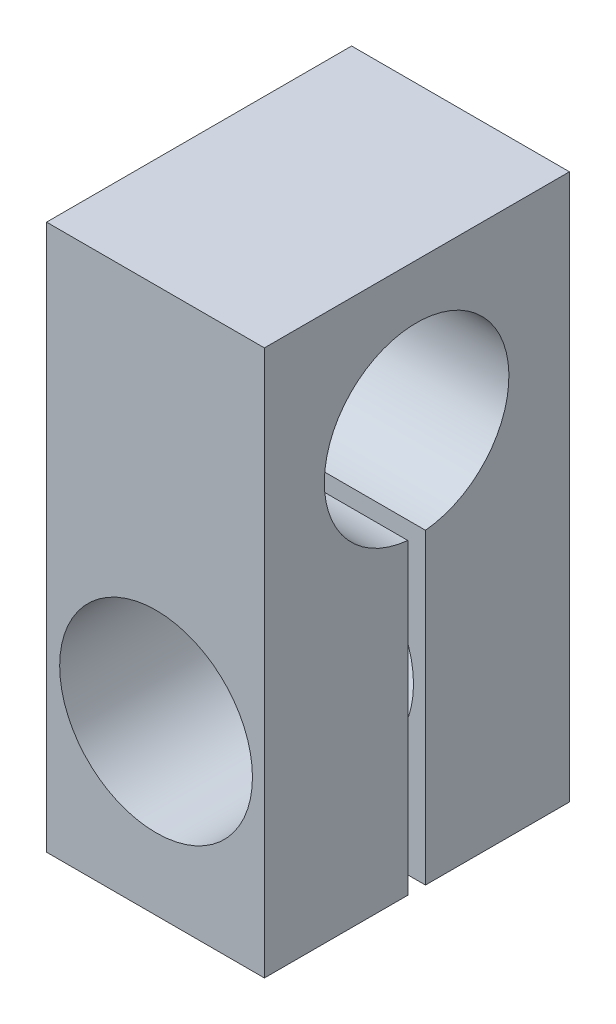
ISO-10303-21;
HEADER;
FILE_DESCRIPTION(('STEP AP214'),'2;1');
FILE_NAME('part.step','',(''),(''),'','','');
FILE_SCHEMA(('AUTOMOTIVE_DESIGN { 1 0 10303 214 1 1 1 1 }'));
ENDSEC;
DATA;
#1=APPLICATION_CONTEXT('core data for automotive mechanical design processes');
#2=APPLICATION_PROTOCOL_DEFINITION('international standard','automotive_design',2000,#1);
#3=PRODUCT_CONTEXT('',#1,'mechanical');
#4=PRODUCT('Part','Part','',(#3));
#5=PRODUCT_RELATED_PRODUCT_CATEGORY('part','',(#4));
#6=PRODUCT_DEFINITION_FORMATION('','',#4);
#7=PRODUCT_DEFINITION_CONTEXT('part definition',#1,'design');
#8=PRODUCT_DEFINITION('design','',#6,#7);
#9=PRODUCT_DEFINITION_SHAPE('','',#8);
#10=(LENGTH_UNIT() NAMED_UNIT(*) SI_UNIT(.MILLI.,.METRE.));
#11=(NAMED_UNIT(*) PLANE_ANGLE_UNIT() SI_UNIT($,.RADIAN.));
#12=(NAMED_UNIT(*) SI_UNIT($,.STERADIAN.) SOLID_ANGLE_UNIT());
#13=UNCERTAINTY_MEASURE_WITH_UNIT(LENGTH_MEASURE(1.E-05),#10,'distance_accuracy_value','');
#14=(GEOMETRIC_REPRESENTATION_CONTEXT(3) GLOBAL_UNCERTAINTY_ASSIGNED_CONTEXT((#13)) GLOBAL_UNIT_ASSIGNED_CONTEXT((#10,
#11,#12)) REPRESENTATION_CONTEXT('',''));
#15=CARTESIAN_POINT('',(0.,0.,0.));
#16=DIRECTION('',(0.,0.,1.));
#17=DIRECTION('',(1.,0.,0.));
#18=AXIS2_PLACEMENT_3D('',#15,#16,#17);
#19=CARTESIAN_POINT('',(3.5875,-9.91643382354598,-4.20832578777919));
#20=DIRECTION('',(0.,0.999999923726654,-0.000390572255170123));
#21=DIRECTION('',(0.,0.000390572255170123,0.999999923726654));
#22=AXIS2_PLACEMENT_3D('',#19,#20,#21);
#23=PLANE('',#22);
#24=DIRECTION('',(0.,-0.000390572255170123,-0.999999923726654));
#25=VECTOR('',#24,1.);
#26=CARTESIAN_POINT('',(0.,-9.91643382354598,-4.20832578777919));
#27=LINE('',#26,#25);
#28=CARTESIAN_POINT('',(0.,-9.91643382354598,-4.20832578777919));
#29=VERTEX_POINT('',#28);
#30=CARTESIAN_POINT('',(0.,-9.91736000646712,-6.57967408053012));
#31=VERTEX_POINT('',#30);
#32=EDGE_CURVE('E141',#29,#31,#27,.T.);
#33=ORIENTED_EDGE('',*,*,#32,.T.);
#34=DIRECTION('',(-1.,0.,0.));
#35=VECTOR('',#34,1.);
#36=CARTESIAN_POINT('',(3.5875,-9.91736000646712,-6.57967408053012));
#37=LINE('',#36,#35);
#38=CARTESIAN_POINT('',(3.5875,-9.91736000646712,-6.57967408053012));
#39=VERTEX_POINT('',#38);
#40=EDGE_CURVE('E11',#39,#31,#37,.T.);
#41=ORIENTED_EDGE('',*,*,#40,.F.);
#42=DIRECTION('',(0.,-0.000390572255170123,-0.999999923726654));
#43=VECTOR('',#42,1.);
#44=CARTESIAN_POINT('',(3.5875,-9.91643382354598,-4.20832578777919));
#45=LINE('',#44,#43);
#46=CARTESIAN_POINT('',(3.5875,-9.91643382354598,-4.20832578777919));
#47=VERTEX_POINT('',#46);
#48=EDGE_CURVE('E164',#47,#39,#45,.T.);
#49=ORIENTED_EDGE('',*,*,#48,.F.);
#50=DIRECTION('',(-1.,0.,0.));
#51=VECTOR('',#50,1.);
#52=CARTESIAN_POINT('',(3.5875,-9.91643382354598,-4.20832578777919));
#53=LINE('',#52,#51);
#54=EDGE_CURVE('E137',#47,#29,#53,.T.);
#55=ORIENTED_EDGE('',*,*,#54,.T.);
#56=EDGE_LOOP('',(#33,#41,#49,#55));
#57=FACE_BOUND('',#56,.T.);
#58=ADVANCED_FACE('F39',(#57),#23,.F.);
#59=CARTESIAN_POINT('',(3.5875,-9.91736000646712,-6.57967408053012));
#60=DIRECTION('',(0.,0.,1.));
#61=DIRECTION('',(1.,0.,0.));
#62=AXIS2_PLACEMENT_3D('',#59,#60,#61);
#63=PLANE('',#62);
#64=CARTESIAN_POINT('',(1.80331141635293,-7.14932449934391,-6.57967408053012));
#65=DIRECTION('',(0.,0.,1.));
#66=DIRECTION('',(1.,0.,0.));
#67=AXIS2_PLACEMENT_3D('',#64,#65,#66);
#68=CIRCLE('',#67,1.5875);
#69=CARTESIAN_POINT('',(3.39081141635293,-7.14932449934391,-6.57967408053012));
#70=VERTEX_POINT('',#69);
#71=EDGE_CURVE('E146',#70,#70,#68,.T.);
#72=ORIENTED_EDGE('',*,*,#71,.T.);
#73=EDGE_LOOP('',(#72));
#74=FACE_BOUND('',#73,.T.);
#75=DIRECTION('',(0.,1.,0.));
#76=VECTOR('',#75,1.);
#77=CARTESIAN_POINT('',(0.,-9.91736000646712,-6.57967408053012));
#78=LINE('',#77,#76);
#79=CARTESIAN_POINT('',(0.,-0.928463249188956,-6.57967408053012));
#80=VERTEX_POINT('',#79);
#81=EDGE_CURVE('E145',#31,#80,#78,.T.);
#82=ORIENTED_EDGE('',*,*,#81,.T.);
#83=DIRECTION('',(-1.,0.,0.));
#84=VECTOR('',#83,1.);
#85=CARTESIAN_POINT('',(3.5875,-0.928463249188956,-6.57967408053012));
#86=LINE('',#85,#84);
#87=CARTESIAN_POINT('',(3.5875,-0.928463249188956,-6.57967408053012));
#88=VERTEX_POINT('',#87);
#89=EDGE_CURVE('E49',#88,#80,#86,.T.);
#90=ORIENTED_EDGE('',*,*,#89,.F.);
#91=DIRECTION('',(0.,1.,0.));
#92=VECTOR('',#91,1.);
#93=CARTESIAN_POINT('',(3.5875,-9.91736000646712,-6.57967408053012));
#94=LINE('',#93,#92);
#95=EDGE_CURVE('E100',#39,#88,#94,.T.);
#96=ORIENTED_EDGE('',*,*,#95,.F.);
#97=ORIENTED_EDGE('',*,*,#40,.T.);
#98=EDGE_LOOP('',(#82,#90,#96,#97));
#99=FACE_BOUND('',#98,.T.);
#100=ADVANCED_FACE('F234',(#74,#99),#63,.F.);
#101=CARTESIAN_POINT('',(3.5875,-0.928463249188956,-1.55613054033977));
#102=DIRECTION('',(0.,-1.,0.));
#103=DIRECTION('',(0.,0.,-1.));
#104=AXIS2_PLACEMENT_3D('',#101,#102,#103);
#105=PLANE('',#104);
#106=DIRECTION('',(0.,0.,1.));
#107=VECTOR('',#106,1.);
#108=CARTESIAN_POINT('',(0.,-0.928463249188956,-1.55613054033977));
#109=LINE('',#108,#107);
#110=CARTESIAN_POINT('',(0.,-0.928463249188956,-1.55613054033977));
#111=VERTEX_POINT('',#110);
#112=EDGE_CURVE('E149',#80,#111,#109,.T.);
#113=ORIENTED_EDGE('',*,*,#112,.T.);
#114=DIRECTION('',(-1.,0.,0.));
#115=VECTOR('',#114,1.);
#116=CARTESIAN_POINT('',(3.5875,-0.928463249188956,-1.55613054033977));
#117=LINE('',#116,#115);
#118=CARTESIAN_POINT('',(3.5875,-0.928463249188956,-1.55613054033977));
#119=VERTEX_POINT('',#118);
#120=EDGE_CURVE('E175',#119,#111,#117,.T.);
#121=ORIENTED_EDGE('',*,*,#120,.F.);
#122=DIRECTION('',(0.,0.,1.));
#123=VECTOR('',#122,1.);
#124=CARTESIAN_POINT('',(3.5875,-0.928463249188956,-1.55613054033977));
#125=LINE('',#124,#123);
#126=EDGE_CURVE('E186',#88,#119,#125,.T.);
#127=ORIENTED_EDGE('',*,*,#126,.F.);
#128=ORIENTED_EDGE('',*,*,#89,.T.);
#129=EDGE_LOOP('',(#113,#121,#127,#128));
#130=FACE_BOUND('',#129,.T.);
#131=ADVANCED_FACE('F184',(#130),#105,.F.);
#132=CARTESIAN_POINT('',(3.5875,-0.928463249188956,-1.55613054033977));
#133=DIRECTION('',(0.,0.,-1.));
#134=DIRECTION('',(-1.,0.,0.));
#135=AXIS2_PLACEMENT_3D('',#132,#133,#134);
#136=PLANE('',#135);
#137=CARTESIAN_POINT('',(1.80331141635293,-7.14932449934391,-1.55613054033977));
#138=DIRECTION('',(0.,0.,1.));
#139=DIRECTION('',(1.,0.,0.));
#140=AXIS2_PLACEMENT_3D('',#137,#138,#139);
#141=CIRCLE('',#140,1.5875);
#142=CARTESIAN_POINT('',(3.39081141635293,-7.14932449934391,-1.55613054033977));
#143=VERTEX_POINT('',#142);
#144=EDGE_CURVE('E216',#143,#143,#141,.T.);
#145=ORIENTED_EDGE('',*,*,#144,.F.);
#146=EDGE_LOOP('',(#145));
#147=FACE_BOUND('',#146,.T.);
#148=DIRECTION('',(0.,-1.,0.));
#149=VECTOR('',#148,1.);
#150=CARTESIAN_POINT('',(0.,-0.928463249188956,-1.55613054033977));
#151=LINE('',#150,#149);
#152=CARTESIAN_POINT('',(0.,-9.91539794958803,-1.55613054033977));
#153=VERTEX_POINT('',#152);
#154=EDGE_CURVE('E152',#111,#153,#151,.T.);
#155=ORIENTED_EDGE('',*,*,#154,.T.);
#156=DIRECTION('',(-1.,0.,0.));
#157=VECTOR('',#156,1.);
#158=CARTESIAN_POINT('',(3.5875,-9.91539794958803,-1.55613054033977));
#159=LINE('',#158,#157);
#160=CARTESIAN_POINT('',(3.5875,-9.91539794958803,-1.55613054033977));
#161=VERTEX_POINT('',#160);
#162=EDGE_CURVE('E171',#161,#153,#159,.T.);
#163=ORIENTED_EDGE('',*,*,#162,.F.);
#164=DIRECTION('',(0.,-1.,0.));
#165=VECTOR('',#164,1.);
#166=CARTESIAN_POINT('',(3.5875,-0.928463249188956,-1.55613054033977));
#167=LINE('',#166,#165);
#168=EDGE_CURVE('E199',#119,#161,#167,.T.);
#169=ORIENTED_EDGE('',*,*,#168,.F.);
#170=ORIENTED_EDGE('',*,*,#120,.T.);
#171=EDGE_LOOP('',(#155,#163,#169,#170));
#172=FACE_BOUND('',#171,.T.);
#173=ADVANCED_FACE('F194',(#147,#172),#136,.F.);
#174=CARTESIAN_POINT('',(3.5875,-9.91539794958803,-1.55613054033977));
#175=DIRECTION('',(0.,0.999999923726654,-0.00039057225516928));
#176=DIRECTION('',(0.,0.00039057225516928,0.999999923726654));
#177=AXIS2_PLACEMENT_3D('',#174,#175,#176);
#178=PLANE('',#177);
#179=DIRECTION('',(0.,-0.00039057225516928,-0.999999923726654));
#180=VECTOR('',#179,1.);
#181=CARTESIAN_POINT('',(0.,-9.91539794958803,-1.55613054033977));
#182=LINE('',#181,#180);
#183=CARTESIAN_POINT('',(0.,-9.91632031855928,-3.91771380358104));
#184=VERTEX_POINT('',#183);
#185=EDGE_CURVE('E155',#153,#184,#182,.T.);
#186=ORIENTED_EDGE('',*,*,#185,.T.);
#187=DIRECTION('',(-1.,0.,0.));
#188=VECTOR('',#187,1.);
#189=CARTESIAN_POINT('',(3.5875,-9.91632031855928,-3.91771380358104));
#190=LINE('',#189,#188);
#191=CARTESIAN_POINT('',(3.5875,-9.91632031855928,-3.91771380358104));
#192=VERTEX_POINT('',#191);
#193=EDGE_CURVE('E130',#192,#184,#190,.T.);
#194=ORIENTED_EDGE('',*,*,#193,.F.);
#195=DIRECTION('',(0.,-0.00039057225516928,-0.999999923726654));
#196=VECTOR('',#195,1.);
#197=CARTESIAN_POINT('',(3.5875,-9.91539794958803,-1.55613054033977));
#198=LINE('',#197,#196);
#199=EDGE_CURVE('E119',#161,#192,#198,.T.);
#200=ORIENTED_EDGE('',*,*,#199,.F.);
#201=ORIENTED_EDGE('',*,*,#162,.T.);
#202=EDGE_LOOP('',(#186,#194,#200,#201));
#203=FACE_BOUND('',#202,.T.);
#204=ADVANCED_FACE('F197',(#203),#178,.F.);
#205=CARTESIAN_POINT('',(3.5875,-4.85549859568574,-3.91771380358104));
#206=DIRECTION('',(0.,0.,1.));
#207=DIRECTION('',(1.,0.,0.));
#208=AXIS2_PLACEMENT_3D('',#205,#206,#207);
#209=PLANE('',#208);
#210=CARTESIAN_POINT('',(1.80331141635293,-7.14932449934391,-3.91771380358104));
#211=DIRECTION('',(0.,0.,1.));
#212=DIRECTION('',(1.,0.,0.));
#213=AXIS2_PLACEMENT_3D('',#210,#211,#212);
#214=CIRCLE('',#213,1.5875);
#215=CARTESIAN_POINT('',(3.39081141635293,-7.14932449934391,-3.91771380358104));
#216=VERTEX_POINT('',#215);
#217=EDGE_CURVE('E212',#216,#216,#214,.T.);
#218=ORIENTED_EDGE('',*,*,#217,.T.);
#219=EDGE_LOOP('',(#218));
#220=FACE_BOUND('',#219,.T.);
#221=DIRECTION('',(0.,1.,0.));
#222=VECTOR('',#221,1.);
#223=CARTESIAN_POINT('',(0.,-4.85549859568574,-3.91771380358104));
#224=LINE('',#223,#222);
#225=CARTESIAN_POINT('',(0.,-4.85549859568574,-3.91771380358104));
#226=VERTEX_POINT('',#225);
#227=EDGE_CURVE('E128',#184,#226,#224,.T.);
#228=ORIENTED_EDGE('',*,*,#227,.T.);
#229=DIRECTION('',(-1.,0.,0.));
#230=VECTOR('',#229,1.);
#231=CARTESIAN_POINT('',(3.5875,-4.85549859568574,-3.91771380358104));
#232=LINE('',#231,#230);
#233=CARTESIAN_POINT('',(3.5875,-4.85549859568574,-3.91771380358104));
#234=VERTEX_POINT('',#233);
#235=EDGE_CURVE('E125',#234,#226,#232,.T.);
#236=ORIENTED_EDGE('',*,*,#235,.F.);
#237=DIRECTION('',(0.,1.,0.));
#238=VECTOR('',#237,1.);
#239=CARTESIAN_POINT('',(3.5875,-4.85549859568574,-3.91771380358104));
#240=LINE('',#239,#238);
#241=EDGE_CURVE('E113',#192,#234,#240,.T.);
#242=ORIENTED_EDGE('',*,*,#241,.F.);
#243=ORIENTED_EDGE('',*,*,#193,.T.);
#244=EDGE_LOOP('',(#228,#236,#242,#243));
#245=FACE_BOUND('',#244,.T.);
#246=ADVANCED_FACE('F126',(#220,#245),#209,.F.);
#247=CARTESIAN_POINT('',(3.5875,-3.34244148680697,-4.0628281904331));
#248=DIRECTION('',(-1.,0.,0.));
#249=DIRECTION('',(0.,0.,1.));
#250=AXIS2_PLACEMENT_3D('',#247,#248,#249);
#251=CYLINDRICAL_SURFACE('',#250,1.52);
#252=CARTESIAN_POINT('',(0.,-3.34244148680697,-4.0628281904331));
#253=DIRECTION('',(-1.,0.,0.));
#254=DIRECTION('',(0.,0.,-1.));
#255=AXIS2_PLACEMENT_3D('',#252,#253,#254);
#256=CIRCLE('',#255,1.52);
#257=CARTESIAN_POINT('',(0.,-4.85546179373168,-4.20832578777919));
#258=VERTEX_POINT('',#257);
#259=EDGE_CURVE('E86',#226,#258,#256,.T.);
#260=ORIENTED_EDGE('',*,*,#259,.T.);
#261=DIRECTION('',(-1.,0.,0.));
#262=VECTOR('',#261,1.);
#263=CARTESIAN_POINT('',(3.5875,-4.85546179373168,-4.20832578777919));
#264=LINE('',#263,#262);
#265=CARTESIAN_POINT('',(3.5875,-4.85546179373168,-4.20832578777919));
#266=VERTEX_POINT('',#265);
#267=EDGE_CURVE('E131',#266,#258,#264,.T.);
#268=ORIENTED_EDGE('',*,*,#267,.F.);
#269=CARTESIAN_POINT('',(3.5875,-3.34244148680697,-4.0628281904331));
#270=DIRECTION('',(-1.,0.,0.));
#271=DIRECTION('',(0.,0.,-1.));
#272=AXIS2_PLACEMENT_3D('',#269,#270,#271);
#273=CIRCLE('',#272,1.52);
#274=EDGE_CURVE('E117',#234,#266,#273,.T.);
#275=ORIENTED_EDGE('',*,*,#274,.F.);
#276=ORIENTED_EDGE('',*,*,#235,.T.);
#277=EDGE_LOOP('',(#260,#268,#275,#276));
#278=FACE_BOUND('',#277,.T.);
#279=ADVANCED_FACE('F133',(#278),#251,.F.);
#280=CARTESIAN_POINT('',(3.5875,-4.85546179373168,-4.20832578777919));
#281=DIRECTION('',(0.,0.,-1.));
#282=DIRECTION('',(-1.,0.,0.));
#283=AXIS2_PLACEMENT_3D('',#280,#281,#282);
#284=PLANE('',#283);
#285=CARTESIAN_POINT('',(1.80331141635293,-7.14932449934391,-4.20832578777919));
#286=DIRECTION('',(0.,0.,-1.));
#287=DIRECTION('',(-1.,0.,0.));
#288=AXIS2_PLACEMENT_3D('',#285,#286,#287);
#289=CIRCLE('',#288,1.5875);
#290=CARTESIAN_POINT('',(3.39081141635293,-7.14932449934391,-4.20832578777919));
#291=VERTEX_POINT('',#290);
#292=EDGE_CURVE('E42',#291,#291,#289,.T.);
#293=ORIENTED_EDGE('',*,*,#292,.T.);
#294=EDGE_LOOP('',(#293));
#295=FACE_BOUND('',#294,.T.);
#296=DIRECTION('',(0.,-1.,0.));
#297=VECTOR('',#296,1.);
#298=CARTESIAN_POINT('',(0.,-4.85546179373168,-4.20832578777919));
#299=LINE('',#298,#297);
#300=EDGE_CURVE('E92',#258,#29,#299,.T.);
#301=ORIENTED_EDGE('',*,*,#300,.T.);
#302=ORIENTED_EDGE('',*,*,#54,.F.);
#303=DIRECTION('',(0.,-1.,0.));
#304=VECTOR('',#303,1.);
#305=CARTESIAN_POINT('',(3.5875,-4.85546179373168,-4.20832578777919));
#306=LINE('',#305,#304);
#307=EDGE_CURVE('E57',#266,#47,#306,.T.);
#308=ORIENTED_EDGE('',*,*,#307,.F.);
#309=ORIENTED_EDGE('',*,*,#267,.T.);
#310=EDGE_LOOP('',(#301,#302,#308,#309));
#311=FACE_BOUND('',#310,.T.);
#312=ADVANCED_FACE('F225',(#295,#311),#284,.F.);
#313=CARTESIAN_POINT('',(3.5875,-3.34244148680697,-4.0628281904331));
#314=DIRECTION('',(1.,0.,0.));
#315=DIRECTION('',(0.,0.,-1.));
#316=AXIS2_PLACEMENT_3D('',#313,#314,#315);
#317=PLANE('',#316);
#318=ORIENTED_EDGE('',*,*,#48,.T.);
#319=ORIENTED_EDGE('',*,*,#95,.T.);
#320=ORIENTED_EDGE('',*,*,#126,.T.);
#321=ORIENTED_EDGE('',*,*,#168,.T.);
#322=ORIENTED_EDGE('',*,*,#199,.T.);
#323=ORIENTED_EDGE('',*,*,#241,.T.);
#324=ORIENTED_EDGE('',*,*,#274,.T.);
#325=ORIENTED_EDGE('',*,*,#307,.T.);
#326=EDGE_LOOP('',(#318,#319,#320,#321,#322,#323,#324,#325));
#327=FACE_BOUND('',#326,.T.);
#328=ADVANCED_FACE('F115',(#327),#317,.T.);
#329=CARTESIAN_POINT('',(0.,-3.34244148680697,-4.0628281904331));
#330=DIRECTION('',(1.,0.,0.));
#331=DIRECTION('',(0.,0.,-1.));
#332=AXIS2_PLACEMENT_3D('',#329,#330,#331);
#333=PLANE('',#332);
#334=ORIENTED_EDGE('',*,*,#32,.F.);
#335=ORIENTED_EDGE('',*,*,#300,.F.);
#336=ORIENTED_EDGE('',*,*,#259,.F.);
#337=ORIENTED_EDGE('',*,*,#227,.F.);
#338=ORIENTED_EDGE('',*,*,#185,.F.);
#339=ORIENTED_EDGE('',*,*,#154,.F.);
#340=ORIENTED_EDGE('',*,*,#112,.F.);
#341=ORIENTED_EDGE('',*,*,#81,.F.);
#342=EDGE_LOOP('',(#334,#335,#336,#337,#338,#339,#340,#341));
#343=FACE_BOUND('',#342,.T.);
#344=ADVANCED_FACE('F190',(#343),#333,.F.);
#345=CARTESIAN_POINT('',(1.80331141635293,-7.14932449934391,-7.14363054033976));
#346=DIRECTION('',(0.,0.,1.));
#347=DIRECTION('',(1.,0.,0.));
#348=AXIS2_PLACEMENT_3D('',#345,#346,#347);
#349=CYLINDRICAL_SURFACE('',#348,1.5875);
#350=CARTESIAN_POINT('',(3.39081141635293,-7.14932449934391,-4.20832578777919));
#351=CARTESIAN_POINT('',(3.39081141635293,-7.14932449934391,-4.23302733249534));
#352=CARTESIAN_POINT('',(3.39081141635293,-7.14932449934391,-4.2577288772115));
#353=CARTESIAN_POINT('',(3.39081141635293,-7.14932449934391,-4.30713196664381));
#354=CARTESIAN_POINT('',(3.39081141635293,-7.14932449934391,-4.33183351135997));
#355=CARTESIAN_POINT('',(3.39081141635293,-7.14932449934391,-4.38123660079228));
#356=CARTESIAN_POINT('',(3.39081141635293,-7.14932449934391,-4.40593814550843));
#357=CARTESIAN_POINT('',(3.39081141635293,-7.14932449934391,-4.45534123494074));
#358=CARTESIAN_POINT('',(3.39081141635293,-7.14932449934391,-4.4800427796569));
#359=CARTESIAN_POINT('',(3.39081141635293,-7.14932449934391,-4.52944586908921));
#360=CARTESIAN_POINT('',(3.39081141635293,-7.14932449934391,-4.55414741380537));
#361=CARTESIAN_POINT('',(3.39081141635293,-7.14932449934391,-4.60355050323768));
#362=CARTESIAN_POINT('',(3.39081141635293,-7.14932449934391,-4.62825204795383));
#363=CARTESIAN_POINT('',(3.39081141635293,-7.14932449934391,-4.67765513738614));
#364=CARTESIAN_POINT('',(3.39081141635293,-7.14932449934391,-4.7023566821023));
#365=CARTESIAN_POINT('',(3.39081141635293,-7.14932449934391,-4.75175977153461));
#366=CARTESIAN_POINT('',(3.39081141635293,-7.14932449934391,-4.77646131625077));
#367=CARTESIAN_POINT('',(3.39081141635293,-7.14932449934391,-4.82586440568308));
#368=CARTESIAN_POINT('',(3.39081141635293,-7.14932449934391,-4.85056595039923));
#369=CARTESIAN_POINT('',(3.39081141635293,-7.14932449934391,-4.89996903983154));
#370=CARTESIAN_POINT('',(3.39081141635293,-7.14932449934391,-4.9246705845477));
#371=CARTESIAN_POINT('',(3.39081141635293,-7.14932449934391,-4.97407367398001));
#372=CARTESIAN_POINT('',(3.39081141635293,-7.14932449934391,-4.99877521869616));
#373=CARTESIAN_POINT('',(3.39081141635293,-7.14932449934391,-5.04817830812848));
#374=CARTESIAN_POINT('',(3.39081141635293,-7.14932449934391,-5.07287985284463));
#375=CARTESIAN_POINT('',(3.39081141635293,-7.14932449934391,-5.12228294227694));
#376=CARTESIAN_POINT('',(3.39081141635293,-7.14932449934391,-5.1469844869931));
#377=CARTESIAN_POINT('',(3.39081141635293,-7.14932449934391,-5.19638757642541));
#378=CARTESIAN_POINT('',(3.39081141635293,-7.14932449934391,-5.22108912114156));
#379=CARTESIAN_POINT('',(3.39081141635293,-7.14932449934391,-5.27049221057387));
#380=CARTESIAN_POINT('',(3.39081141635293,-7.14932449934391,-5.29519375529003));
#381=CARTESIAN_POINT('',(3.39081141635293,-7.14932449934391,-5.34459684472234));
#382=CARTESIAN_POINT('',(3.39081141635293,-7.14932449934391,-5.3692983894385));
#383=CARTESIAN_POINT('',(3.39081141635293,-7.14932449934391,-5.41870147887081));
#384=CARTESIAN_POINT('',(3.39081141635293,-7.14932449934391,-5.44340302358696));
#385=CARTESIAN_POINT('',(3.39081141635293,-7.14932449934391,-5.49280611301927));
#386=CARTESIAN_POINT('',(3.39081141635293,-7.14932449934391,-5.51750765773543));
#387=CARTESIAN_POINT('',(3.39081141635293,-7.14932449934391,-5.56691074716774));
#388=CARTESIAN_POINT('',(3.39081141635293,-7.14932449934391,-5.5916122918839));
#389=CARTESIAN_POINT('',(3.39081141635293,-7.14932449934391,-5.64101538131621));
#390=CARTESIAN_POINT('',(3.39081141635293,-7.14932449934391,-5.66571692603236));
#391=CARTESIAN_POINT('',(3.39081141635293,-7.14932449934391,-5.71512001546467));
#392=CARTESIAN_POINT('',(3.39081141635293,-7.14932449934391,-5.73982156018083));
#393=CARTESIAN_POINT('',(3.39081141635293,-7.14932449934391,-5.78922464961314));
#394=CARTESIAN_POINT('',(3.39081141635293,-7.14932449934391,-5.8139261943293));
#395=CARTESIAN_POINT('',(3.39081141635293,-7.14932449934391,-5.86332928376161));
#396=CARTESIAN_POINT('',(3.39081141635293,-7.14932449934391,-5.88803082847776));
#397=CARTESIAN_POINT('',(3.39081141635293,-7.14932449934391,-5.93743391791007));
#398=CARTESIAN_POINT('',(3.39081141635293,-7.14932449934391,-5.96213546262623));
#399=CARTESIAN_POINT('',(3.39081141635293,-7.14932449934391,-6.01153855205854));
#400=CARTESIAN_POINT('',(3.39081141635293,-7.14932449934391,-6.0362400967747));
#401=CARTESIAN_POINT('',(3.39081141635293,-7.14932449934391,-6.08564318620701));
#402=CARTESIAN_POINT('',(3.39081141635293,-7.14932449934391,-6.11034473092316));
#403=CARTESIAN_POINT('',(3.39081141635293,-7.14932449934391,-6.15974782035547));
#404=CARTESIAN_POINT('',(3.39081141635293,-7.14932449934391,-6.18444936507163));
#405=CARTESIAN_POINT('',(3.39081141635293,-7.14932449934391,-6.23385245450394));
#406=CARTESIAN_POINT('',(3.39081141635293,-7.14932449934391,-6.2585539992201));
#407=CARTESIAN_POINT('',(3.39081141635293,-7.14932449934391,-6.30795708865241));
#408=CARTESIAN_POINT('',(3.39081141635293,-7.14932449934391,-6.33265863336856));
#409=CARTESIAN_POINT('',(3.39081141635293,-7.14932449934391,-6.38206172280087));
#410=CARTESIAN_POINT('',(3.39081141635293,-7.14932449934391,-6.40676326751703));
#411=CARTESIAN_POINT('',(3.39081141635293,-7.14932449934391,-6.45616635694934));
#412=CARTESIAN_POINT('',(3.39081141635293,-7.14932449934391,-6.4808679016655));
#413=CARTESIAN_POINT('',(3.39081141635293,-7.14932449934391,-6.53027099109781));
#414=CARTESIAN_POINT('',(3.39081141635293,-7.14932449934391,-6.55497253581396));
#415=CARTESIAN_POINT('',(3.39081141635293,-7.14932449934391,-6.57967408053012));
#416=B_SPLINE_CURVE_WITH_KNOTS('',3,(#350,#351,#352,#353,#354,#355,#356,#357,#358,#359,#360,
#361,#362,#363,#364,#365,#366,#367,#368,#369,#370,#371,#372,#373,#374,#375,#376,#377,#378,#379,
#380,#381,#382,#383,#384,#385,#386,#387,#388,#389,#390,#391,#392,#393,#394,#395,#396,#397,#398,
#399,#400,#401,#402,#403,#404,#405,#406,#407,#408,#409,#410,#411,#412,#413,#414,#415),
.UNSPECIFIED.,.F.,.F.,(4,2,2,2,2,2,2,2,2,2,2,2,2,2,2,2,2,2,2,2,2,2,2,2,2,2,2,2,2,2,2,2,4),(0.,
0.0741046341484666,0.148209268296933,0.2223139024454,0.296418536593866,0.370523170742333,
0.444627804890799,0.518732439039266,0.592837073187732,0.666941707336199,0.741046341484666,
0.815150975633132,0.889255609781599,0.963360243930065,1.03746487807853,1.111569512227,
1.18567414637546,1.25977878052393,1.3338834146724,1.40798804882086,1.48209268296933,
1.5561973171178,1.63030195126626,1.70440658541473,1.7785112195632,1.85261585371166,
1.92672048786013,2.0008251220086,2.07492975615706,2.14903439030553,2.223139024454,
2.29724365860246,2.37134829275093),.UNSPECIFIED.);
#417=EDGE_CURVE('BSEAM227',#291,#70,#416,.T.);
#418=ORIENTED_EDGE('',*,*,#292,.F.);
#419=ORIENTED_EDGE('',*,*,#71,.F.);
#420=ORIENTED_EDGE('',*,*,#417,.T.);
#421=ORIENTED_EDGE('',*,*,#417,.F.);
#422=EDGE_LOOP('',(#418,#420,#419,#421));
#423=FACE_BOUND('',#422,.T.);
#424=ADVANCED_FACE('F227',(#423),#349,.F.);
#425=CARTESIAN_POINT('',(3.39081141635293,-7.14932449934391,-1.55613054033977));
#426=CARTESIAN_POINT('',(3.39081141635293,-7.14932449934391,-1.58073036599853));
#427=CARTESIAN_POINT('',(3.39081141635293,-7.14932449934391,-1.60533019165729));
#428=CARTESIAN_POINT('',(3.39081141635293,-7.14932449934391,-1.65452984297482));
#429=CARTESIAN_POINT('',(3.39081141635293,-7.14932449934391,-1.67912966863358));
#430=CARTESIAN_POINT('',(3.39081141635293,-7.14932449934391,-1.72832931995111));
#431=CARTESIAN_POINT('',(3.39081141635293,-7.14932449934391,-1.75292914560987));
#432=CARTESIAN_POINT('',(3.39081141635293,-7.14932449934391,-1.8021287969274));
#433=CARTESIAN_POINT('',(3.39081141635293,-7.14932449934391,-1.82672862258616));
#434=CARTESIAN_POINT('',(3.39081141635293,-7.14932449934391,-1.87592827390369));
#435=CARTESIAN_POINT('',(3.39081141635293,-7.14932449934391,-1.90052809956245));
#436=CARTESIAN_POINT('',(3.39081141635293,-7.14932449934391,-1.94972775087998));
#437=CARTESIAN_POINT('',(3.39081141635293,-7.14932449934391,-1.97432757653874));
#438=CARTESIAN_POINT('',(3.39081141635293,-7.14932449934391,-2.02352722785627));
#439=CARTESIAN_POINT('',(3.39081141635293,-7.14932449934391,-2.04812705351503));
#440=CARTESIAN_POINT('',(3.39081141635293,-7.14932449934391,-2.09732670483256));
#441=CARTESIAN_POINT('',(3.39081141635293,-7.14932449934391,-2.12192653049132));
#442=CARTESIAN_POINT('',(3.39081141635293,-7.14932449934391,-2.17112618180885));
#443=CARTESIAN_POINT('',(3.39081141635293,-7.14932449934391,-2.19572600746761));
#444=CARTESIAN_POINT('',(3.39081141635293,-7.14932449934391,-2.24492565878514));
#445=CARTESIAN_POINT('',(3.39081141635293,-7.14932449934391,-2.2695254844439));
#446=CARTESIAN_POINT('',(3.39081141635293,-7.14932449934391,-2.31872513576143));
#447=CARTESIAN_POINT('',(3.39081141635293,-7.14932449934391,-2.34332496142019));
#448=CARTESIAN_POINT('',(3.39081141635293,-7.14932449934391,-2.39252461273772));
#449=CARTESIAN_POINT('',(3.39081141635293,-7.14932449934391,-2.41712443839648));
#450=CARTESIAN_POINT('',(3.39081141635293,-7.14932449934391,-2.46632408971401));
#451=CARTESIAN_POINT('',(3.39081141635293,-7.14932449934391,-2.49092391537277));
#452=CARTESIAN_POINT('',(3.39081141635293,-7.14932449934391,-2.5401235666903));
#453=CARTESIAN_POINT('',(3.39081141635293,-7.14932449934391,-2.56472339234906));
#454=CARTESIAN_POINT('',(3.39081141635293,-7.14932449934391,-2.61392304366659));
#455=CARTESIAN_POINT('',(3.39081141635293,-7.14932449934391,-2.63852286932535));
#456=CARTESIAN_POINT('',(3.39081141635293,-7.14932449934391,-2.68772252064288));
#457=CARTESIAN_POINT('',(3.39081141635293,-7.14932449934391,-2.71232234630164));
#458=CARTESIAN_POINT('',(3.39081141635293,-7.14932449934391,-2.76152199761917));
#459=CARTESIAN_POINT('',(3.39081141635293,-7.14932449934391,-2.78612182327793));
#460=CARTESIAN_POINT('',(3.39081141635293,-7.14932449934391,-2.83532147459546));
#461=CARTESIAN_POINT('',(3.39081141635293,-7.14932449934391,-2.85992130025422));
#462=CARTESIAN_POINT('',(3.39081141635293,-7.14932449934391,-2.90912095157175));
#463=CARTESIAN_POINT('',(3.39081141635293,-7.14932449934391,-2.93372077723051));
#464=CARTESIAN_POINT('',(3.39081141635293,-7.14932449934391,-2.98292042854804));
#465=CARTESIAN_POINT('',(3.39081141635293,-7.14932449934391,-3.0075202542068));
#466=CARTESIAN_POINT('',(3.39081141635293,-7.14932449934391,-3.05671990552433));
#467=CARTESIAN_POINT('',(3.39081141635293,-7.14932449934391,-3.08131973118309));
#468=CARTESIAN_POINT('',(3.39081141635293,-7.14932449934391,-3.13051938250062));
#469=CARTESIAN_POINT('',(3.39081141635293,-7.14932449934391,-3.15511920815938));
#470=CARTESIAN_POINT('',(3.39081141635293,-7.14932449934391,-3.20431885947691));
#471=CARTESIAN_POINT('',(3.39081141635293,-7.14932449934391,-3.22891868513567));
#472=CARTESIAN_POINT('',(3.39081141635293,-7.14932449934391,-3.2781183364532));
#473=CARTESIAN_POINT('',(3.39081141635293,-7.14932449934391,-3.30271816211196));
#474=CARTESIAN_POINT('',(3.39081141635293,-7.14932449934391,-3.35191781342949));
#475=CARTESIAN_POINT('',(3.39081141635293,-7.14932449934391,-3.37651763908825));
#476=CARTESIAN_POINT('',(3.39081141635293,-7.14932449934391,-3.42571729040578));
#477=CARTESIAN_POINT('',(3.39081141635293,-7.14932449934391,-3.45031711606454));
#478=CARTESIAN_POINT('',(3.39081141635293,-7.14932449934391,-3.49951676738207));
#479=CARTESIAN_POINT('',(3.39081141635293,-7.14932449934391,-3.52411659304083));
#480=CARTESIAN_POINT('',(3.39081141635293,-7.14932449934391,-3.57331624435836));
#481=CARTESIAN_POINT('',(3.39081141635293,-7.14932449934391,-3.59791607001712));
#482=CARTESIAN_POINT('',(3.39081141635293,-7.14932449934391,-3.64711572133465));
#483=CARTESIAN_POINT('',(3.39081141635293,-7.14932449934391,-3.67171554699341));
#484=CARTESIAN_POINT('',(3.39081141635293,-7.14932449934391,-3.72091519831093));
#485=CARTESIAN_POINT('',(3.39081141635293,-7.14932449934391,-3.7455150239697));
#486=CARTESIAN_POINT('',(3.39081141635293,-7.14932449934391,-3.79471467528722));
#487=CARTESIAN_POINT('',(3.39081141635293,-7.14932449934391,-3.81931450094599));
#488=CARTESIAN_POINT('',(3.39081141635293,-7.14932449934391,-3.86851415226351));
#489=CARTESIAN_POINT('',(3.39081141635293,-7.14932449934391,-3.89311397792228));
#490=CARTESIAN_POINT('',(3.39081141635293,-7.14932449934391,-3.91771380358104));
#491=B_SPLINE_CURVE_WITH_KNOTS('',3,(#425,#426,#427,#428,#429,#430,#431,#432,#433,#434,#435,
#436,#437,#438,#439,#440,#441,#442,#443,#444,#445,#446,#447,#448,#449,#450,#451,#452,#453,#454,
#455,#456,#457,#458,#459,#460,#461,#462,#463,#464,#465,#466,#467,#468,#469,#470,#471,#472,#473,
#474,#475,#476,#477,#478,#479,#480,#481,#482,#483,#484,#485,#486,#487,#488,#489,#490),
.UNSPECIFIED.,.F.,.F.,(4,2,2,2,2,2,2,2,2,2,2,2,2,2,2,2,2,2,2,2,2,2,2,2,2,2,2,2,2,2,2,2,4),(0.,
0.0737994769762895,0.14759895395258,0.22139843092887,0.29519790790516,0.368997384881449,
0.442796861857739,0.51659633883403,0.590395815810319,0.664195292786609,0.737994769762899,
0.811794246739189,0.885593723715479,0.959393200691768,1.03319267766806,1.10699215464435,
1.18079163162064,1.25459110859693,1.32839058557322,1.40219006254951,1.4759895395258,
1.54978901650209,1.62358849347838,1.69738797045467,1.77118744743096,1.84498692440725,
1.91878640138354,1.99258587835983,2.06638535533612,2.14018483231241,2.2139843092887,
2.28778378626499,2.36158326324128),.UNSPECIFIED.);
#492=EDGE_CURVE('BSEAM230',#143,#216,#491,.T.);
#493=ORIENTED_EDGE('',*,*,#144,.T.);
#494=ORIENTED_EDGE('',*,*,#217,.F.);
#495=ORIENTED_EDGE('',*,*,#492,.T.);
#496=ORIENTED_EDGE('',*,*,#492,.F.);
#497=EDGE_LOOP('',(#493,#495,#494,#496));
#498=FACE_BOUND('',#497,.T.);
#499=ADVANCED_FACE('F230',(#498),#349,.F.);
#500=CLOSED_SHELL('',(#58,#100,#131,#173,#204,#246,#279,#312,#328,#344,#424,#499));
#501=MANIFOLD_SOLID_BREP('B2',#500);
#502=ADVANCED_BREP_SHAPE_REPRESENTATION('',(#18,#501),#14);
#503=SHAPE_DEFINITION_REPRESENTATION(#9,#502);
ENDSEC;
END-ISO-10303-21;
